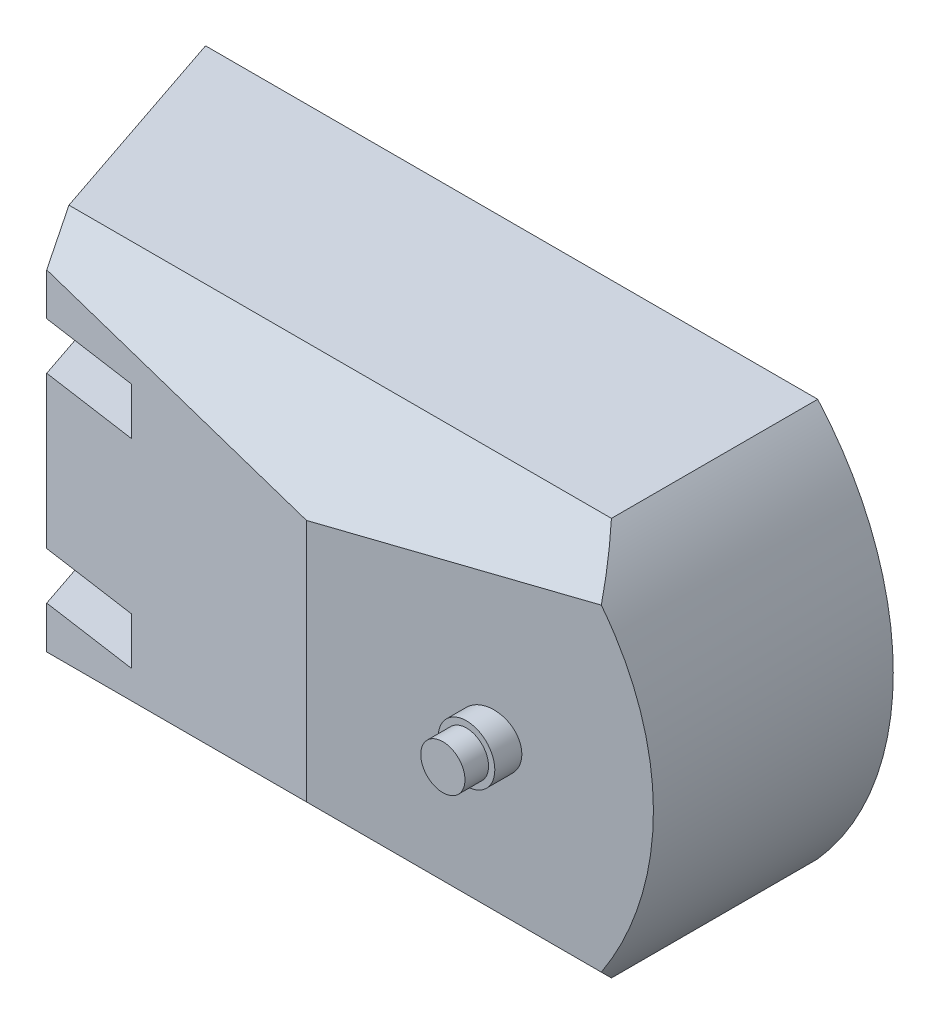
ISO-10303-21;
HEADER;
FILE_DESCRIPTION(('STEP AP214'),'2;1');
FILE_NAME('part.step','',(''),(''),'','','');
FILE_SCHEMA(('AUTOMOTIVE_DESIGN { 1 0 10303 214 1 1 1 1 }'));
ENDSEC;
DATA;
#1=APPLICATION_CONTEXT('core data for automotive mechanical design processes');
#2=APPLICATION_PROTOCOL_DEFINITION('international standard','automotive_design',2000,#1);
#3=PRODUCT_CONTEXT('',#1,'mechanical');
#4=PRODUCT('Part','Part','',(#3));
#5=PRODUCT_RELATED_PRODUCT_CATEGORY('part','',(#4));
#6=PRODUCT_DEFINITION_FORMATION('','',#4);
#7=PRODUCT_DEFINITION_CONTEXT('part definition',#1,'design');
#8=PRODUCT_DEFINITION('design','',#6,#7);
#9=PRODUCT_DEFINITION_SHAPE('','',#8);
#10=(LENGTH_UNIT() NAMED_UNIT(*) SI_UNIT(.MILLI.,.METRE.));
#11=(NAMED_UNIT(*) PLANE_ANGLE_UNIT() SI_UNIT($,.RADIAN.));
#12=(NAMED_UNIT(*) SI_UNIT($,.STERADIAN.) SOLID_ANGLE_UNIT());
#13=UNCERTAINTY_MEASURE_WITH_UNIT(LENGTH_MEASURE(1.E-05),#10,'distance_accuracy_value','');
#14=(GEOMETRIC_REPRESENTATION_CONTEXT(3) GLOBAL_UNCERTAINTY_ASSIGNED_CONTEXT((#13)) GLOBAL_UNIT_ASSIGNED_CONTEXT((#10,
#11,#12)) REPRESENTATION_CONTEXT('',''));
#15=CARTESIAN_POINT('',(0.,0.,0.));
#16=DIRECTION('',(0.,0.,1.));
#17=DIRECTION('',(1.,0.,0.));
#18=AXIS2_PLACEMENT_3D('',#15,#16,#17);
#19=CARTESIAN_POINT('',(-25135.3672162667,15090.4019973768,3000.));
#20=DIRECTION('',(0.,-1.,0.));
#21=DIRECTION('',(1.,0.,0.));
#22=AXIS2_PLACEMENT_3D('',#19,#20,#21);
#23=PLANE('',#22);
#24=DIRECTION('',(0.32020262993435,0.,0.947349078103275));
#25=VECTOR('',#24,1.);
#26=CARTESIAN_POINT('',(-22561.6903101328,15090.401997377,7625.81897217112));
#27=LINE('',#26,#25);
#28=CARTESIAN_POINT('',(-25135.3672162667,15090.401997377,11.3579514682041));
#29=VERTEX_POINT('',#28);
#30=CARTESIAN_POINT('',(-24401.1072626944,15090.401997377,2183.73389431267));
#31=VERTEX_POINT('',#30);
#32=EDGE_CURVE('E213',#29,#31,#27,.T.);
#33=ORIENTED_EDGE('',*,*,#32,.T.);
#34=DIRECTION('',(1.,0.,0.));
#35=VECTOR('',#34,1.);
#36=CARTESIAN_POINT('',(-25135.3672162667,15090.401997377,2183.73389431267));
#37=LINE('',#36,#35);
#38=CARTESIAN_POINT('',(-18658.5503124367,15090.401997377,2183.73389431267));
#39=VERTEX_POINT('',#38);
#40=EDGE_CURVE('E194',#31,#39,#37,.T.);
#41=ORIENTED_EDGE('',*,*,#40,.T.);
#42=DIRECTION('',(0.,0.,-1.));
#43=VECTOR('',#42,1.);
#44=CARTESIAN_POINT('',(-18658.5503124367,15090.401997377,3000.));
#45=LINE('',#44,#43);
#46=CARTESIAN_POINT('',(-18658.5503124367,15090.401997377,0.));
#47=VERTEX_POINT('',#46);
#48=EDGE_CURVE('E242',#39,#47,#45,.T.);
#49=ORIENTED_EDGE('',*,*,#48,.T.);
#50=DIRECTION('',(-1.,0.,0.));
#51=VECTOR('',#50,1.);
#52=CARTESIAN_POINT('',(-25135.3672162667,15090.4019973768,0.));
#53=LINE('',#52,#51);
#54=CARTESIAN_POINT('',(-25135.3672162667,15090.4019973768,0.));
#55=VERTEX_POINT('',#54);
#56=EDGE_CURVE('E230',#47,#55,#53,.T.);
#57=ORIENTED_EDGE('',*,*,#56,.T.);
#58=DIRECTION('',(0.,0.,-1.));
#59=VECTOR('',#58,1.);
#60=CARTESIAN_POINT('',(-25135.3672162667,15090.4019973768,3000.));
#61=LINE('',#60,#59);
#62=EDGE_CURVE('E248',#29,#55,#61,.T.);
#63=ORIENTED_EDGE('',*,*,#62,.F.);
#64=EDGE_LOOP('',(#33,#41,#49,#57,#63));
#65=FACE_BOUND('',#64,.T.);
#66=ADVANCED_FACE('F33',(#65),#23,.F.);
#67=CARTESIAN_POINT('',(-18658.5503124367,10876.7228833229,3000.));
#68=DIRECTION('',(0.,1.,0.));
#69=DIRECTION('',(-1.,0.,0.));
#70=AXIS2_PLACEMENT_3D('',#67,#68,#69);
#71=PLANE('',#70);
#72=DIRECTION('',(0.,0.,-1.));
#73=VECTOR('',#72,1.);
#74=CARTESIAN_POINT('',(-18658.5503124367,10876.7228833229,3000.));
#75=LINE('',#74,#73);
#76=CARTESIAN_POINT('',(-18658.5503124369,10876.7228833228,2183.73389431267));
#77=VERTEX_POINT('',#76);
#78=CARTESIAN_POINT('',(-18658.5503124367,10876.7228833229,0.));
#79=VERTEX_POINT('',#78);
#80=EDGE_CURVE('E244',#77,#79,#75,.T.);
#81=ORIENTED_EDGE('',*,*,#80,.F.);
#82=DIRECTION('',(1.,0.,0.));
#83=VECTOR('',#82,1.);
#84=CARTESIAN_POINT('',(-25135.3672162667,10876.7228833228,2183.73389431267));
#85=LINE('',#84,#83);
#86=CARTESIAN_POINT('',(-24401.1072626943,10876.7228833228,2183.73389431267));
#87=VERTEX_POINT('',#86);
#88=EDGE_CURVE('E193',#87,#77,#85,.T.);
#89=ORIENTED_EDGE('',*,*,#88,.F.);
#90=DIRECTION('',(0.32020262993435,0.,0.947349078103275));
#91=VECTOR('',#90,1.);
#92=CARTESIAN_POINT('',(-22561.6903101327,10876.7228833228,7625.81897217112));
#93=LINE('',#92,#91);
#94=CARTESIAN_POINT('',(-25135.3672162667,10876.7228833228,11.3579514679909));
#95=VERTEX_POINT('',#94);
#96=EDGE_CURVE('E216',#95,#87,#93,.T.);
#97=ORIENTED_EDGE('',*,*,#96,.F.);
#98=DIRECTION('',(0.,0.,-1.));
#99=VECTOR('',#98,1.);
#100=CARTESIAN_POINT('',(-25135.3672162667,10876.7228833229,3000.));
#101=LINE('',#100,#99);
#102=CARTESIAN_POINT('',(-25135.3672162667,10876.7228833229,0.));
#103=VERTEX_POINT('',#102);
#104=EDGE_CURVE('E246',#95,#103,#101,.T.);
#105=ORIENTED_EDGE('',*,*,#104,.T.);
#106=DIRECTION('',(1.,0.,0.));
#107=VECTOR('',#106,1.);
#108=CARTESIAN_POINT('',(-18658.5503124367,10876.7228833229,0.));
#109=LINE('',#108,#107);
#110=EDGE_CURVE('E236',#103,#79,#109,.T.);
#111=ORIENTED_EDGE('',*,*,#110,.T.);
#112=EDGE_LOOP('',(#81,#89,#97,#105,#111));
#113=FACE_BOUND('',#112,.T.);
#114=ADVANCED_FACE('F319',(#113),#71,.F.);
#115=CARTESIAN_POINT('',(-25135.3672162667,10876.7228833229,3000.));
#116=DIRECTION('',(1.,0.,0.));
#117=DIRECTION('',(0.,0.,-1.));
#118=AXIS2_PLACEMENT_3D('',#115,#116,#117);
#119=PLANE('',#118);
#120=DIRECTION('',(0.,-1.,0.));
#121=VECTOR('',#120,1.);
#122=CARTESIAN_POINT('',(-25135.3672162667,10876.722883323,11.3579514679909));
#123=LINE('',#122,#121);
#124=EDGE_CURVE('E250',#29,#95,#123,.T.);
#125=ORIENTED_EDGE('',*,*,#124,.F.);
#126=ORIENTED_EDGE('',*,*,#62,.T.);
#127=DIRECTION('',(0.,-1.,0.));
#128=VECTOR('',#127,1.);
#129=CARTESIAN_POINT('',(-25135.3672162667,10876.7228833229,0.));
#130=LINE('',#129,#128);
#131=EDGE_CURVE('E233',#55,#103,#130,.T.);
#132=ORIENTED_EDGE('',*,*,#131,.T.);
#133=ORIENTED_EDGE('',*,*,#104,.F.);
#134=EDGE_LOOP('',(#125,#126,#132,#133));
#135=FACE_BOUND('',#134,.T.);
#136=ADVANCED_FACE('F324',(#135),#119,.F.);
#137=CARTESIAN_POINT('',(-21033.8086312193,12983.5624403499,3000.));
#138=DIRECTION('',(0.,0.,-1.));
#139=DIRECTION('',(-1.,0.,0.));
#140=AXIS2_PLACEMENT_3D('',#137,#138,#139);
#141=CYLINDRICAL_SURFACE('',#140,3175.);
#142=ORIENTED_EDGE('',*,*,#48,.F.);
#143=CARTESIAN_POINT('',(-21033.8086312193,12983.5624403499,4290.57345133968));
#144=DIRECTION('',(0.,-0.707106781186544,-0.707106781186552));
#145=DIRECTION('',(0.,0.707106781186552,-0.707106781186544));
#146=AXIS2_PLACEMENT_3D('',#143,#144,#145);
#147=ELLIPSE('',#146,4490.12806053455,3175.);
#148=CARTESIAN_POINT('',(-18341.1629315927,14665.9072731004,2608.2286185892));
#149=VERTEX_POINT('',#148);
#150=EDGE_CURVE('E210',#39,#149,#147,.T.);
#151=ORIENTED_EDGE('',*,*,#150,.T.);
#152=CARTESIAN_POINT('',(-21033.8086312193,12983.5624403499,2994.81512738939));
#153=DIRECTION('',(0.14211404355638,0.,0.989850291015796));
#154=DIRECTION('',(0.989850291015796,0.,-0.14211404355638));
#155=AXIS2_PLACEMENT_3D('',#152,#153,#154);
#156=ELLIPSE('',#155,3207.55575748912,3175.);
#157=CARTESIAN_POINT('',(-18341.1629315928,11301.2176075993,2608.22861858922));
#158=VERTEX_POINT('',#157);
#159=EDGE_CURVE('E227',#158,#149,#156,.T.);
#160=ORIENTED_EDGE('',*,*,#159,.F.);
#161=CARTESIAN_POINT('',(-21033.8086312193,12983.5624403499,4290.57345133982));
#162=DIRECTION('',(0.,0.707106781186544,-0.707106781186551));
#163=DIRECTION('',(0.,-0.707106781186551,-0.707106781186544));
#164=AXIS2_PLACEMENT_3D('',#161,#162,#163);
#165=ELLIPSE('',#164,4490.12806053455,3175.);
#166=EDGE_CURVE('E202',#158,#77,#165,.T.);
#167=ORIENTED_EDGE('',*,*,#166,.T.);
#168=ORIENTED_EDGE('',*,*,#80,.T.);
#169=CARTESIAN_POINT('',(-21033.8086312193,12983.5624403499,0.));
#170=DIRECTION('',(0.,0.,1.));
#171=DIRECTION('',(1.,0.,0.));
#172=AXIS2_PLACEMENT_3D('',#169,#170,#171);
#173=CIRCLE('',#172,3175.);
#174=EDGE_CURVE('E239',#79,#47,#173,.T.);
#175=ORIENTED_EDGE('',*,*,#174,.T.);
#176=EDGE_LOOP('',(#142,#151,#160,#167,#168,#175));
#177=FACE_BOUND('',#176,.T.);
#178=ADVANCED_FACE('F376',(#177),#141,.T.);
#179=CARTESIAN_POINT('',(-21033.8086312193,12983.5624403499,0.));
#180=DIRECTION('',(0.,0.,1.));
#181=DIRECTION('',(1.,0.,0.));
#182=AXIS2_PLACEMENT_3D('',#179,#180,#181);
#183=PLANE('',#182);
#184=CARTESIAN_POINT('',(-20757.1879477292,12983.5624403498,0.));
#185=DIRECTION('',(0.,0.,1.));
#186=DIRECTION('',(1.,0.,0.));
#187=AXIS2_PLACEMENT_3D('',#184,#185,#186);
#188=CIRCLE('',#187,950.000000000001);
#189=CARTESIAN_POINT('',(-19807.1879477292,12983.5624403498,0.));
#190=VERTEX_POINT('',#189);
#191=EDGE_CURVE('E12',#190,#190,#188,.F.);
#192=ORIENTED_EDGE('',*,*,#191,.F.);
#193=EDGE_LOOP('',(#192));
#194=FACE_BOUND('',#193,.T.);
#195=ORIENTED_EDGE('',*,*,#56,.F.);
#196=ORIENTED_EDGE('',*,*,#174,.F.);
#197=ORIENTED_EDGE('',*,*,#110,.F.);
#198=ORIENTED_EDGE('',*,*,#131,.F.);
#199=EDGE_LOOP('',(#195,#196,#197,#198));
#200=FACE_BOUND('',#199,.T.);
#201=ADVANCED_FACE('F379',(#194,#200),#183,.F.);
#202=CARTESIAN_POINT('',(-3.52172393380601,10876.7228833232,-24.5294509489163));
#203=DIRECTION('',(0.14211404355638,0.,0.989850291015796));
#204=DIRECTION('',(0.989850291015796,0.,-0.14211404355638));
#205=AXIS2_PLACEMENT_3D('',#202,#203,#204);
#206=PLANE('',#205);
#207=CARTESIAN_POINT('',(-19376.7582167177,12983.5624403499,2756.91032812935));
#208=DIRECTION('',(0.14211404355638,0.,0.989850291015796));
#209=DIRECTION('',(0.989850291015796,0.,-0.14211404355638));
#210=AXIS2_PLACEMENT_3D('',#207,#208,#209);
#211=ELLIPSE('',#210,303.076134565903,300.000000000002);
#212=CARTESIAN_POINT('',(-19076.7582167177,12983.5624403499,2713.83895314075));
#213=VERTEX_POINT('',#212);
#214=EDGE_CURVE('E176',#213,#213,#211,.F.);
#215=ORIENTED_EDGE('',*,*,#214,.T.);
#216=EDGE_LOOP('',(#215));
#217=FACE_BOUND('',#216,.T.);
#218=DIRECTION('',(0.980003488088964,0.140700325752047,-0.140700325752045));
#219=VECTOR('',#218,1.);
#220=CARTESIAN_POINT('',(-889.022883731094,17171.5328342837,102.603057405959));
#221=LINE('',#220,#219);
#222=CARTESIAN_POINT('',(-21069.9222167178,14274.1358916896,3000.));
#223=VERTEX_POINT('',#222);
#224=EDGE_CURVE('E208',#223,#149,#221,.T.);
#225=ORIENTED_EDGE('',*,*,#224,.F.);
#226=DIRECTION('',(0.,1.,0.));
#227=VECTOR('',#226,1.);
#228=CARTESIAN_POINT('',(-21069.9222167177,10876.7228833228,3000.));
#229=LINE('',#228,#227);
#230=CARTESIAN_POINT('',(-21069.9222167177,11692.9889890101,3000.));
#231=VERTEX_POINT('',#230);
#232=EDGE_CURVE('E223',#231,#223,#229,.T.);
#233=ORIENTED_EDGE('',*,*,#232,.F.);
#234=DIRECTION('',(-0.980003488088964,0.140700325752046,0.140700325752045));
#235=VECTOR('',#234,1.);
#236=CARTESIAN_POINT('',(-308.012112278987,8712.17560371729,19.1866147072193));
#237=LINE('',#236,#235);
#238=EDGE_CURVE('E200',#158,#231,#237,.T.);
#239=ORIENTED_EDGE('',*,*,#238,.F.);
#240=ORIENTED_EDGE('',*,*,#159,.T.);
#241=EDGE_LOOP('',(#225,#233,#239,#240));
#242=FACE_BOUND('',#241,.T.);
#243=ADVANCED_FACE('F373',(#217,#242),#206,.T.);
#244=CARTESIAN_POINT('',(-22561.6903101327,10876.7228833228,7625.81897217112));
#245=DIRECTION('',(-0.947349078103275,0.,0.32020262993435));
#246=DIRECTION('',(0.32020262993435,0.,0.947349078103275));
#247=AXIS2_PLACEMENT_3D('',#244,#245,#246);
#248=PLANE('',#247);
#249=DIRECTION('',(-0.32020262993435,0.,-0.947349078103275));
#250=VECTOR('',#249,1.);
#251=CARTESIAN_POINT('',(-22561.6903101328,14286.9822188635,7625.81897217113));
#252=LINE('',#251,#250);
#253=CARTESIAN_POINT('',(-24281.0358022162,14286.9822188635,2538.97640876006));
#254=VERTEX_POINT('',#253);
#255=CARTESIAN_POINT('',(-24632.2083385222,14286.9822188635,1500.));
#256=VERTEX_POINT('',#255);
#257=EDGE_CURVE('E191',#254,#256,#252,.T.);
#258=ORIENTED_EDGE('',*,*,#257,.F.);
#259=DIRECTION('',(0.,1.,0.));
#260=VECTOR('',#259,1.);
#261=CARTESIAN_POINT('',(-24281.0358022161,10876.7228833228,2538.97640876006));
#262=LINE('',#261,#260);
#263=CARTESIAN_POINT('',(-24281.0358022162,14735.1594829296,2538.97640876006));
#264=VERTEX_POINT('',#263);
#265=EDGE_CURVE('E219',#254,#264,#262,.T.);
#266=ORIENTED_EDGE('',*,*,#265,.T.);
#267=DIRECTION('',(0.232454203475413,-0.687737247532305,0.687737247532297));
#268=VECTOR('',#267,1.);
#269=CARTESIAN_POINT('',(-22758.072395001,10229.3314698803,7044.80442180926));
#270=LINE('',#269,#268);
#271=EDGE_CURVE('E205',#31,#264,#270,.T.);
#272=ORIENTED_EDGE('',*,*,#271,.F.);
#273=ORIENTED_EDGE('',*,*,#32,.F.);
#274=ORIENTED_EDGE('',*,*,#124,.T.);
#275=ORIENTED_EDGE('',*,*,#96,.T.);
#276=DIRECTION('',(-0.232454203475391,-0.687737247532308,-0.687737247532301));
#277=VECTOR('',#276,1.);
#278=CARTESIAN_POINT('',(-23431.7023787088,13744.7968380583,5051.8078490482));
#279=LINE('',#278,#277);
#280=CARTESIAN_POINT('',(-24281.0358022162,11231.9653977702,2538.97640876005));
#281=VERTEX_POINT('',#280);
#282=EDGE_CURVE('E197',#281,#87,#279,.T.);
#283=ORIENTED_EDGE('',*,*,#282,.F.);
#284=CARTESIAN_POINT('',(-24281.0358022161,11680.1426618364,2538.97640876006));
#285=VERTEX_POINT('',#284);
#286=EDGE_CURVE('E220',#281,#285,#262,.T.);
#287=ORIENTED_EDGE('',*,*,#286,.T.);
#288=DIRECTION('',(0.32020262993435,0.,0.947349078103275));
#289=VECTOR('',#288,1.);
#290=CARTESIAN_POINT('',(-22561.6903101327,11680.1426618365,7625.8189721711));
#291=LINE('',#290,#289);
#292=CARTESIAN_POINT('',(-24632.2083385221,11680.1426618363,1500.));
#293=VERTEX_POINT('',#292);
#294=EDGE_CURVE('E55',#293,#285,#291,.T.);
#295=ORIENTED_EDGE('',*,*,#294,.F.);
#296=DIRECTION('',(0.,-1.,0.));
#297=VECTOR('',#296,1.);
#298=CARTESIAN_POINT('',(-24632.2083385221,10876.7228833228,1500.));
#299=LINE('',#298,#297);
#300=CARTESIAN_POINT('',(-24632.2083385221,12180.1426618363,1500.));
#301=VERTEX_POINT('',#300);
#302=EDGE_CURVE('E267',#301,#293,#299,.T.);
#303=ORIENTED_EDGE('',*,*,#302,.F.);
#304=DIRECTION('',(-0.32020262993435,0.,-0.947349078103275));
#305=VECTOR('',#304,1.);
#306=CARTESIAN_POINT('',(-22561.6903101327,12180.1426618365,7625.8189721711));
#307=LINE('',#306,#305);
#308=CARTESIAN_POINT('',(-24281.0358022162,12180.1426618363,2538.97640876005));
#309=VERTEX_POINT('',#308);
#310=EDGE_CURVE('E188',#309,#301,#307,.T.);
#311=ORIENTED_EDGE('',*,*,#310,.F.);
#312=CARTESIAN_POINT('',(-24281.0358022161,13786.9822188635,2538.97640876006));
#313=VERTEX_POINT('',#312);
#314=EDGE_CURVE('E224',#309,#313,#262,.T.);
#315=ORIENTED_EDGE('',*,*,#314,.T.);
#316=DIRECTION('',(0.32020262993435,0.,0.947349078103275));
#317=VECTOR('',#316,1.);
#318=CARTESIAN_POINT('',(-22561.6903101328,13786.9822188635,7625.81897217113));
#319=LINE('',#318,#317);
#320=CARTESIAN_POINT('',(-24632.2083385222,13786.9822188635,1500.));
#321=VERTEX_POINT('',#320);
#322=EDGE_CURVE('E47',#321,#313,#319,.T.);
#323=ORIENTED_EDGE('',*,*,#322,.F.);
#324=DIRECTION('',(0.,1.,0.));
#325=VECTOR('',#324,1.);
#326=CARTESIAN_POINT('',(-24632.2083385221,10876.7228833228,1500.));
#327=LINE('',#326,#325);
#328=EDGE_CURVE('E154',#321,#256,#327,.T.);
#329=ORIENTED_EDGE('',*,*,#328,.T.);
#330=EDGE_LOOP('',(#258,#266,#272,#273,#274,#275,#283,#287,#295,#303,#311,#315,#323,#329));
#331=FACE_BOUND('',#330,.T.);
#332=ADVANCED_FACE('F333',(#331),#248,.T.);
#333=CARTESIAN_POINT('',(-847.55148816409,10876.7228833232,5903.35104269325));
#334=DIRECTION('',(-0.14211404355638,0.,0.989850291015796));
#335=DIRECTION('',(0.989850291015796,0.,0.14211404355638));
#336=AXIS2_PLACEMENT_3D('',#333,#334,#335);
#337=PLANE('',#336);
#338=DIRECTION('',(-0.989850291015796,0.,-0.14211404355638));
#339=VECTOR('',#338,1.);
#340=CARTESIAN_POINT('',(-847.551488164088,14286.9822188634,5903.35104269326));
#341=LINE('',#340,#339);
#342=CARTESIAN_POINT('',(-23230.3672162667,14286.9822188635,2689.82221094062));
#343=VERTEX_POINT('',#342);
#344=EDGE_CURVE('E265',#343,#254,#341,.T.);
#345=ORIENTED_EDGE('',*,*,#344,.F.);
#346=DIRECTION('',(0.,1.,0.));
#347=VECTOR('',#346,1.);
#348=CARTESIAN_POINT('',(-23230.3672162667,10876.7228833232,2689.82221094061));
#349=LINE('',#348,#347);
#350=CARTESIAN_POINT('',(-23230.3672162667,13786.9822188635,2689.82221094062));
#351=VERTEX_POINT('',#350);
#352=EDGE_CURVE('E263',#351,#343,#349,.T.);
#353=ORIENTED_EDGE('',*,*,#352,.F.);
#354=DIRECTION('',(0.989850291015796,0.,0.14211404355638));
#355=VECTOR('',#354,1.);
#356=CARTESIAN_POINT('',(-847.551488164094,13786.9822188635,5903.35104269326));
#357=LINE('',#356,#355);
#358=EDGE_CURVE('E160',#313,#351,#357,.T.);
#359=ORIENTED_EDGE('',*,*,#358,.F.);
#360=ORIENTED_EDGE('',*,*,#314,.F.);
#361=DIRECTION('',(-0.989850291015796,0.,-0.14211404355638));
#362=VECTOR('',#361,1.);
#363=CARTESIAN_POINT('',(-847.551488164175,12180.1426618379,5903.35104269324));
#364=LINE('',#363,#362);
#365=CARTESIAN_POINT('',(-23230.3672162667,12180.1426618364,2689.82221094061));
#366=VERTEX_POINT('',#365);
#367=EDGE_CURVE('E260',#366,#309,#364,.T.);
#368=ORIENTED_EDGE('',*,*,#367,.F.);
#369=DIRECTION('',(0.,1.,0.));
#370=VECTOR('',#369,1.);
#371=CARTESIAN_POINT('',(-23230.3672162667,10876.7228833232,2689.82221094061));
#372=LINE('',#371,#370);
#373=CARTESIAN_POINT('',(-23230.3672162667,11680.1426618364,2689.82221094061));
#374=VERTEX_POINT('',#373);
#375=EDGE_CURVE('E258',#374,#366,#372,.T.);
#376=ORIENTED_EDGE('',*,*,#375,.F.);
#377=DIRECTION('',(0.989850291015796,0.,0.14211404355638));
#378=VECTOR('',#377,1.);
#379=CARTESIAN_POINT('',(-847.551488164144,11680.1426618379,5903.35104269324));
#380=LINE('',#379,#378);
#381=EDGE_CURVE('E256',#285,#374,#380,.T.);
#382=ORIENTED_EDGE('',*,*,#381,.F.);
#383=ORIENTED_EDGE('',*,*,#286,.F.);
#384=DIRECTION('',(-0.980003488088964,-0.140700325752047,-0.140700325752045));
#385=VECTOR('',#384,1.);
#386=CARTESIAN_POINT('',(-1360.43763122114,14522.7043270565,5829.71533804637));
#387=LINE('',#386,#385);
#388=EDGE_CURVE('E252',#231,#281,#387,.T.);
#389=ORIENTED_EDGE('',*,*,#388,.F.);
#390=ORIENTED_EDGE('',*,*,#232,.T.);
#391=DIRECTION('',(0.980003488088964,-0.140700325752046,0.140700325752045));
#392=VECTOR('',#391,1.);
#393=CARTESIAN_POINT('',(-779.426859769032,11361.0041109445,5913.13178074512));
#394=LINE('',#393,#392);
#395=EDGE_CURVE('E254',#264,#223,#394,.T.);
#396=ORIENTED_EDGE('',*,*,#395,.F.);
#397=ORIENTED_EDGE('',*,*,#265,.F.);
#398=EDGE_LOOP('',(#345,#353,#359,#360,#368,#376,#382,#383,#389,#390,#396,#397));
#399=FACE_BOUND('',#398,.T.);
#400=ADVANCED_FACE('F348',(#399),#337,.T.);
#401=CARTESIAN_POINT('',(-25135.3672162667,10876.7228833228,2183.73389431267));
#402=DIRECTION('',(0.,0.707106781186544,-0.707106781186551));
#403=DIRECTION('',(0.,0.707106781186551,0.707106781186544));
#404=AXIS2_PLACEMENT_3D('',#401,#402,#403);
#405=PLANE('',#404);
#406=ORIENTED_EDGE('',*,*,#238,.T.);
#407=ORIENTED_EDGE('',*,*,#388,.T.);
#408=ORIENTED_EDGE('',*,*,#282,.T.);
#409=ORIENTED_EDGE('',*,*,#88,.T.);
#410=ORIENTED_EDGE('',*,*,#166,.F.);
#411=EDGE_LOOP('',(#406,#407,#408,#409,#410));
#412=FACE_BOUND('',#411,.T.);
#413=ADVANCED_FACE('F409',(#412),#405,.F.);
#414=CARTESIAN_POINT('',(-25135.3672162667,15090.401997377,2183.73389431267));
#415=DIRECTION('',(0.,-0.707106781186544,-0.707106781186552));
#416=DIRECTION('',(0.,0.707106781186552,-0.707106781186544));
#417=AXIS2_PLACEMENT_3D('',#414,#415,#416);
#418=PLANE('',#417);
#419=ORIENTED_EDGE('',*,*,#40,.F.);
#420=ORIENTED_EDGE('',*,*,#271,.T.);
#421=ORIENTED_EDGE('',*,*,#395,.T.);
#422=ORIENTED_EDGE('',*,*,#224,.T.);
#423=ORIENTED_EDGE('',*,*,#150,.F.);
#424=EDGE_LOOP('',(#419,#420,#421,#422,#423));
#425=FACE_BOUND('',#424,.T.);
#426=ADVANCED_FACE('F369',(#425),#418,.F.);
#427=CARTESIAN_POINT('',(-25135.3672162667,12180.1426618363,1500.));
#428=DIRECTION('',(0.,1.,0.));
#429=DIRECTION('',(-1.,0.,0.));
#430=AXIS2_PLACEMENT_3D('',#427,#428,#429);
#431=PLANE('',#430);
#432=CARTESIAN_POINT('',(-23612.1268411229,12180.1426618364,2183.73389431267));
#433=DIRECTION('',(0.,1.,0.));
#434=DIRECTION('',(-1.,0.,0.));
#435=AXIS2_PLACEMENT_3D('',#432,#433,#434);
#436=CIRCLE('',#435,63.5000000000017);
#437=CARTESIAN_POINT('',(-23675.6268411229,12180.1426618364,2183.73389431267));
#438=VERTEX_POINT('',#437);
#439=EDGE_CURVE('E293',#438,#438,#436,.T.);
#440=ORIENTED_EDGE('',*,*,#439,.T.);
#441=EDGE_LOOP('',(#440));
#442=FACE_BOUND('',#441,.T.);
#443=ORIENTED_EDGE('',*,*,#310,.T.);
#444=DIRECTION('',(-1.,0.,0.));
#445=VECTOR('',#444,1.);
#446=CARTESIAN_POINT('',(-25135.3672162667,12180.1426618363,1500.));
#447=LINE('',#446,#445);
#448=CARTESIAN_POINT('',(-23230.3672162667,12180.1426618364,1500.));
#449=VERTEX_POINT('',#448);
#450=EDGE_CURVE('E179',#449,#301,#447,.T.);
#451=ORIENTED_EDGE('',*,*,#450,.F.);
#452=DIRECTION('',(0.,0.,1.));
#453=VECTOR('',#452,1.);
#454=CARTESIAN_POINT('',(-23230.3672162667,12180.1426618364,1500.));
#455=LINE('',#454,#453);
#456=EDGE_CURVE('E155',#449,#366,#455,.T.);
#457=ORIENTED_EDGE('',*,*,#456,.T.);
#458=ORIENTED_EDGE('',*,*,#367,.T.);
#459=EDGE_LOOP('',(#443,#451,#457,#458));
#460=FACE_BOUND('',#459,.T.);
#461=ADVANCED_FACE('F362',(#442,#460),#431,.F.);
#462=CARTESIAN_POINT('',(-23230.3672162667,11680.1426618364,1500.));
#463=DIRECTION('',(1.,0.,0.));
#464=DIRECTION('',(0.,0.,-1.));
#465=AXIS2_PLACEMENT_3D('',#462,#463,#464);
#466=PLANE('',#465);
#467=ORIENTED_EDGE('',*,*,#375,.T.);
#468=ORIENTED_EDGE('',*,*,#456,.F.);
#469=DIRECTION('',(0.,1.,0.));
#470=VECTOR('',#469,1.);
#471=CARTESIAN_POINT('',(-23230.3672162667,11680.1426618364,1500.));
#472=LINE('',#471,#470);
#473=CARTESIAN_POINT('',(-23230.3672162667,11680.1426618364,1500.));
#474=VERTEX_POINT('',#473);
#475=EDGE_CURVE('E175',#474,#449,#472,.T.);
#476=ORIENTED_EDGE('',*,*,#475,.F.);
#477=DIRECTION('',(0.,0.,1.));
#478=VECTOR('',#477,1.);
#479=CARTESIAN_POINT('',(-23230.3672162667,11680.1426618364,1500.));
#480=LINE('',#479,#478);
#481=EDGE_CURVE('E182',#474,#374,#480,.T.);
#482=ORIENTED_EDGE('',*,*,#481,.T.);
#483=EDGE_LOOP('',(#467,#468,#476,#482));
#484=FACE_BOUND('',#483,.T.);
#485=ADVANCED_FACE('F356',(#484),#466,.F.);
#486=CARTESIAN_POINT('',(-25135.3672162667,11680.1426618363,1500.));
#487=DIRECTION('',(0.,-1.,0.));
#488=DIRECTION('',(1.,0.,0.));
#489=AXIS2_PLACEMENT_3D('',#486,#487,#488);
#490=PLANE('',#489);
#491=CARTESIAN_POINT('',(-23612.1268411229,11680.1426618364,2183.73389431267));
#492=DIRECTION('',(0.,-1.,0.));
#493=DIRECTION('',(1.,0.,0.));
#494=AXIS2_PLACEMENT_3D('',#491,#492,#493);
#495=CIRCLE('',#494,63.5000000000017);
#496=CARTESIAN_POINT('',(-23548.6268411229,11680.1426618364,2183.73389431267));
#497=VERTEX_POINT('',#496);
#498=EDGE_CURVE('E279',#497,#497,#495,.T.);
#499=ORIENTED_EDGE('',*,*,#498,.T.);
#500=EDGE_LOOP('',(#499));
#501=FACE_BOUND('',#500,.T.);
#502=ORIENTED_EDGE('',*,*,#294,.T.);
#503=ORIENTED_EDGE('',*,*,#381,.T.);
#504=ORIENTED_EDGE('',*,*,#481,.F.);
#505=DIRECTION('',(1.,0.,0.));
#506=VECTOR('',#505,1.);
#507=CARTESIAN_POINT('',(-25135.3672162667,11680.1426618363,1500.));
#508=LINE('',#507,#506);
#509=EDGE_CURVE('E173',#293,#474,#508,.T.);
#510=ORIENTED_EDGE('',*,*,#509,.F.);
#511=EDGE_LOOP('',(#502,#503,#504,#510));
#512=FACE_BOUND('',#511,.T.);
#513=ADVANCED_FACE('F353',(#501,#512),#490,.F.);
#514=CARTESIAN_POINT('',(0.,0.,1500.));
#515=DIRECTION('',(0.,0.,-1.));
#516=DIRECTION('',(-1.,0.,0.));
#517=AXIS2_PLACEMENT_3D('',#514,#515,#516);
#518=PLANE('',#517);
#519=ORIENTED_EDGE('',*,*,#302,.T.);
#520=ORIENTED_EDGE('',*,*,#509,.T.);
#521=ORIENTED_EDGE('',*,*,#475,.T.);
#522=ORIENTED_EDGE('',*,*,#450,.T.);
#523=EDGE_LOOP('',(#519,#520,#521,#522));
#524=FACE_BOUND('',#523,.T.);
#525=ADVANCED_FACE('F359',(#524),#518,.F.);
#526=CARTESIAN_POINT('',(-25135.3672162667,14286.9822188635,1500.));
#527=DIRECTION('',(0.,1.,0.));
#528=DIRECTION('',(-1.,0.,0.));
#529=AXIS2_PLACEMENT_3D('',#526,#527,#528);
#530=PLANE('',#529);
#531=CARTESIAN_POINT('',(-23612.1268411229,14286.9822188635,2183.73389431267));
#532=DIRECTION('',(0.,1.,0.));
#533=DIRECTION('',(-1.,0.,0.));
#534=AXIS2_PLACEMENT_3D('',#531,#532,#533);
#535=CIRCLE('',#534,63.5000000000017);
#536=CARTESIAN_POINT('',(-23675.6268411229,14286.9822188635,2183.73389431267));
#537=VERTEX_POINT('',#536);
#538=EDGE_CURVE('E274',#537,#537,#535,.T.);
#539=ORIENTED_EDGE('',*,*,#538,.T.);
#540=EDGE_LOOP('',(#539));
#541=FACE_BOUND('',#540,.T.);
#542=ORIENTED_EDGE('',*,*,#257,.T.);
#543=DIRECTION('',(-1.,0.,0.));
#544=VECTOR('',#543,1.);
#545=CARTESIAN_POINT('',(-25135.3672162667,14286.9822188635,1500.));
#546=LINE('',#545,#544);
#547=CARTESIAN_POINT('',(-23230.3672162667,14286.9822188635,1500.));
#548=VERTEX_POINT('',#547);
#549=EDGE_CURVE('E164',#548,#256,#546,.T.);
#550=ORIENTED_EDGE('',*,*,#549,.F.);
#551=DIRECTION('',(0.,0.,1.));
#552=VECTOR('',#551,1.);
#553=CARTESIAN_POINT('',(-23230.3672162667,14286.9822188635,1500.));
#554=LINE('',#553,#552);
#555=EDGE_CURVE('E163',#548,#343,#554,.T.);
#556=ORIENTED_EDGE('',*,*,#555,.T.);
#557=ORIENTED_EDGE('',*,*,#344,.T.);
#558=EDGE_LOOP('',(#542,#550,#556,#557));
#559=FACE_BOUND('',#558,.T.);
#560=ADVANCED_FACE('F458',(#541,#559),#530,.F.);
#561=CARTESIAN_POINT('',(-23230.3672162667,14286.9822188635,1500.));
#562=DIRECTION('',(1.,0.,0.));
#563=DIRECTION('',(0.,0.,-1.));
#564=AXIS2_PLACEMENT_3D('',#561,#562,#563);
#565=PLANE('',#564);
#566=ORIENTED_EDGE('',*,*,#352,.T.);
#567=ORIENTED_EDGE('',*,*,#555,.F.);
#568=DIRECTION('',(0.,1.,0.));
#569=VECTOR('',#568,1.);
#570=CARTESIAN_POINT('',(-23230.3672162667,14286.9822188635,1500.));
#571=LINE('',#570,#569);
#572=CARTESIAN_POINT('',(-23230.3672162667,13786.9822188635,1500.));
#573=VERTEX_POINT('',#572);
#574=EDGE_CURVE('E151',#573,#548,#571,.T.);
#575=ORIENTED_EDGE('',*,*,#574,.F.);
#576=DIRECTION('',(0.,0.,1.));
#577=VECTOR('',#576,1.);
#578=CARTESIAN_POINT('',(-23230.3672162667,13786.9822188635,1500.));
#579=LINE('',#578,#577);
#580=EDGE_CURVE('E158',#573,#351,#579,.T.);
#581=ORIENTED_EDGE('',*,*,#580,.T.);
#582=EDGE_LOOP('',(#566,#567,#575,#581));
#583=FACE_BOUND('',#582,.T.);
#584=ADVANCED_FACE('F166',(#583),#565,.F.);
#585=CARTESIAN_POINT('',(-25135.3672162667,13786.9822188635,1500.));
#586=DIRECTION('',(0.,-1.,0.));
#587=DIRECTION('',(1.,0.,0.));
#588=AXIS2_PLACEMENT_3D('',#585,#586,#587);
#589=PLANE('',#588);
#590=CARTESIAN_POINT('',(-23612.1268411229,13786.9822188635,2183.73389431267));
#591=DIRECTION('',(0.,-1.,0.));
#592=DIRECTION('',(1.,0.,0.));
#593=AXIS2_PLACEMENT_3D('',#590,#591,#592);
#594=CIRCLE('',#593,63.5000000000017);
#595=CARTESIAN_POINT('',(-23548.6268411229,13786.9822188635,2183.73389431267));
#596=VERTEX_POINT('',#595);
#597=EDGE_CURVE('E272',#596,#596,#594,.T.);
#598=ORIENTED_EDGE('',*,*,#597,.T.);
#599=EDGE_LOOP('',(#598));
#600=FACE_BOUND('',#599,.T.);
#601=ORIENTED_EDGE('',*,*,#322,.T.);
#602=ORIENTED_EDGE('',*,*,#358,.T.);
#603=ORIENTED_EDGE('',*,*,#580,.F.);
#604=DIRECTION('',(1.,0.,0.));
#605=VECTOR('',#604,1.);
#606=CARTESIAN_POINT('',(-25135.3672162667,13786.9822188635,1500.));
#607=LINE('',#606,#605);
#608=EDGE_CURVE('E146',#321,#573,#607,.T.);
#609=ORIENTED_EDGE('',*,*,#608,.F.);
#610=EDGE_LOOP('',(#601,#602,#603,#609));
#611=FACE_BOUND('',#610,.T.);
#612=ADVANCED_FACE('F159',(#600,#611),#589,.F.);
#613=CARTESIAN_POINT('',(0.,0.,1500.));
#614=DIRECTION('',(0.,0.,1.));
#615=DIRECTION('',(1.,0.,0.));
#616=AXIS2_PLACEMENT_3D('',#613,#614,#615);
#617=PLANE('',#616);
#618=ORIENTED_EDGE('',*,*,#608,.T.);
#619=ORIENTED_EDGE('',*,*,#574,.T.);
#620=ORIENTED_EDGE('',*,*,#549,.T.);
#621=ORIENTED_EDGE('',*,*,#328,.F.);
#622=EDGE_LOOP('',(#618,#619,#620,#621));
#623=FACE_BOUND('',#622,.T.);
#624=ADVANCED_FACE('F148',(#623),#617,.T.);
#625=CARTESIAN_POINT('',(-19376.7582167177,12983.5624403499,3000.));
#626=DIRECTION('',(0.,0.,-1.));
#627=DIRECTION('',(-1.,0.,0.));
#628=AXIS2_PLACEMENT_3D('',#625,#626,#627);
#629=CYLINDRICAL_SURFACE('',#628,300.000000000002);
#630=ORIENTED_EDGE('',*,*,#214,.F.);
#631=EDGE_LOOP('',(#630));
#632=FACE_BOUND('',#631,.T.);
#633=CARTESIAN_POINT('',(-19376.7582167177,12983.5624403499,3000.));
#634=DIRECTION('',(0.,0.,1.));
#635=DIRECTION('',(1.,0.,0.));
#636=AXIS2_PLACEMENT_3D('',#633,#634,#635);
#637=CIRCLE('',#636,300.000000000002);
#638=CARTESIAN_POINT('',(-19076.7582167177,12983.5624403499,3000.));
#639=VERTEX_POINT('',#638);
#640=EDGE_CURVE('E271',#639,#639,#637,.T.);
#641=ORIENTED_EDGE('',*,*,#640,.F.);
#642=EDGE_LOOP('',(#641));
#643=FACE_BOUND('',#642,.T.);
#644=ADVANCED_FACE('F305',(#632,#643),#629,.T.);
#645=CARTESIAN_POINT('',(-19376.7582167177,12983.5624403499,3000.));
#646=DIRECTION('',(0.,0.,1.));
#647=DIRECTION('',(1.,0.,0.));
#648=AXIS2_PLACEMENT_3D('',#645,#646,#647);
#649=PLANE('',#648);
#650=CARTESIAN_POINT('',(-19376.7582167177,12983.5624403499,3000.));
#651=DIRECTION('',(0.,0.,1.));
#652=DIRECTION('',(1.,0.,0.));
#653=AXIS2_PLACEMENT_3D('',#650,#651,#652);
#654=CIRCLE('',#653,234.000000000002);
#655=CARTESIAN_POINT('',(-19142.7582167177,12983.5624403499,3000.));
#656=VERTEX_POINT('',#655);
#657=EDGE_CURVE('E40',#656,#656,#654,.T.);
#658=ORIENTED_EDGE('',*,*,#657,.F.);
#659=EDGE_LOOP('',(#658));
#660=FACE_BOUND('',#659,.T.);
#661=ORIENTED_EDGE('',*,*,#640,.T.);
#662=EDGE_LOOP('',(#661));
#663=FACE_BOUND('',#662,.T.);
#664=ADVANCED_FACE('F303',(#660,#663),#649,.T.);
#665=CARTESIAN_POINT('',(-19376.7582167177,12983.5624403499,3250.));
#666=DIRECTION('',(0.,0.,-1.));
#667=DIRECTION('',(-1.,0.,0.));
#668=AXIS2_PLACEMENT_3D('',#665,#666,#667);
#669=CYLINDRICAL_SURFACE('',#668,234.000000000002);
#670=CARTESIAN_POINT('',(-19376.7582167177,12983.5624403499,3250.));
#671=DIRECTION('',(0.,0.,1.));
#672=DIRECTION('',(1.,0.,0.));
#673=AXIS2_PLACEMENT_3D('',#670,#671,#672);
#674=CIRCLE('',#673,234.000000000002);
#675=CARTESIAN_POINT('',(-19142.7582167177,12983.5624403499,3250.));
#676=VERTEX_POINT('',#675);
#677=EDGE_CURVE('E296',#676,#676,#674,.T.);
#678=ORIENTED_EDGE('',*,*,#677,.F.);
#679=EDGE_LOOP('',(#678));
#680=FACE_BOUND('',#679,.T.);
#681=ORIENTED_EDGE('',*,*,#657,.T.);
#682=EDGE_LOOP('',(#681));
#683=FACE_BOUND('',#682,.T.);
#684=ADVANCED_FACE('F313',(#680,#683),#669,.T.);
#685=CARTESIAN_POINT('',(-19376.7582167177,12983.5624403499,3250.));
#686=DIRECTION('',(0.,0.,1.));
#687=DIRECTION('',(1.,0.,0.));
#688=AXIS2_PLACEMENT_3D('',#685,#686,#687);
#689=PLANE('',#688);
#690=ORIENTED_EDGE('',*,*,#677,.T.);
#691=EDGE_LOOP('',(#690));
#692=FACE_BOUND('',#691,.T.);
#693=ADVANCED_FACE('F501',(#692),#689,.T.);
#694=CARTESIAN_POINT('',(-23612.1268411229,14733.5624403498,2183.73389431267));
#695=DIRECTION('',(0.,-1.,0.));
#696=DIRECTION('',(1.,0.,0.));
#697=AXIS2_PLACEMENT_3D('',#694,#695,#696);
#698=CYLINDRICAL_SURFACE('',#697,63.5000000000017);
#699=ORIENTED_EDGE('',*,*,#597,.F.);
#700=EDGE_LOOP('',(#699));
#701=FACE_BOUND('',#700,.T.);
#702=ORIENTED_EDGE('',*,*,#439,.F.);
#703=EDGE_LOOP('',(#702));
#704=FACE_BOUND('',#703,.T.);
#705=ADVANCED_FACE('F511',(#701,#704),#698,.F.);
#706=CARTESIAN_POINT('',(-23612.1268411229,14733.5624403498,2183.73389431267));
#707=DIRECTION('',(0.,-1.,0.));
#708=DIRECTION('',(1.,0.,0.));
#709=AXIS2_PLACEMENT_3D('',#706,#707,#708);
#710=PLANE('',#709);
#711=CARTESIAN_POINT('',(-23612.1268411229,14733.5624403498,2183.73389431267));
#712=DIRECTION('',(0.,-1.,0.));
#713=DIRECTION('',(1.,0.,0.));
#714=AXIS2_PLACEMENT_3D('',#711,#712,#713);
#715=CIRCLE('',#714,63.5000000000017);
#716=CARTESIAN_POINT('',(-23548.6268411229,14733.5624403498,2183.73389431267));
#717=VERTEX_POINT('',#716);
#718=EDGE_CURVE('E275',#717,#717,#715,.T.);
#719=ORIENTED_EDGE('',*,*,#718,.T.);
#720=EDGE_LOOP('',(#719));
#721=FACE_BOUND('',#720,.T.);
#722=ADVANCED_FACE('F548',(#721),#710,.T.);
#723=ORIENTED_EDGE('',*,*,#718,.F.);
#724=EDGE_LOOP('',(#723));
#725=FACE_BOUND('',#724,.T.);
#726=ORIENTED_EDGE('',*,*,#538,.F.);
#727=EDGE_LOOP('',(#726));
#728=FACE_BOUND('',#727,.T.);
#729=ADVANCED_FACE('F552',(#725,#728),#698,.F.);
#730=CARTESIAN_POINT('',(-23612.1268411229,11233.5624403498,2183.73389431267));
#731=DIRECTION('',(0.,-1.,0.));
#732=DIRECTION('',(1.,0.,0.));
#733=AXIS2_PLACEMENT_3D('',#730,#731,#732);
#734=CIRCLE('',#733,63.5000000000017);
#735=CARTESIAN_POINT('',(-23548.6268411229,11233.5624403498,2183.73389431267));
#736=VERTEX_POINT('',#735);
#737=EDGE_CURVE('E282',#736,#736,#734,.T.);
#738=ORIENTED_EDGE('',*,*,#737,.T.);
#739=EDGE_LOOP('',(#738));
#740=FACE_BOUND('',#739,.T.);
#741=ORIENTED_EDGE('',*,*,#498,.F.);
#742=EDGE_LOOP('',(#741));
#743=FACE_BOUND('',#742,.T.);
#744=ADVANCED_FACE('F551',(#740,#743),#698,.F.);
#745=CARTESIAN_POINT('',(-23612.1268411229,11233.5624403498,2183.73389431267));
#746=DIRECTION('',(0.,-1.,0.));
#747=DIRECTION('',(1.,0.,0.));
#748=AXIS2_PLACEMENT_3D('',#745,#746,#747);
#749=PLANE('',#748);
#750=ORIENTED_EDGE('',*,*,#737,.F.);
#751=EDGE_LOOP('',(#750));
#752=FACE_BOUND('',#751,.T.);
#753=ADVANCED_FACE('F576',(#752),#749,.F.);
#754=CARTESIAN_POINT('',(-20757.1879477292,12983.5624403498,-500.));
#755=DIRECTION('',(0.,0.,1.));
#756=DIRECTION('',(1.,0.,0.));
#757=AXIS2_PLACEMENT_3D('',#754,#755,#756);
#758=CYLINDRICAL_SURFACE('',#757,950.000000000001);
#759=CARTESIAN_POINT('',(-20757.1879477292,12983.5624403498,-500.));
#760=DIRECTION('',(0.,0.,-1.));
#761=DIRECTION('',(-1.,0.,0.));
#762=AXIS2_PLACEMENT_3D('',#759,#760,#761);
#763=CIRCLE('',#762,950.000000000001);
#764=CARTESIAN_POINT('',(-21707.1879477293,12983.5624403498,-500.));
#765=VERTEX_POINT('',#764);
#766=EDGE_CURVE('E287',#765,#765,#763,.T.);
#767=ORIENTED_EDGE('',*,*,#766,.F.);
#768=EDGE_LOOP('',(#767));
#769=FACE_BOUND('',#768,.T.);
#770=ORIENTED_EDGE('',*,*,#191,.T.);
#771=EDGE_LOOP('',(#770));
#772=FACE_BOUND('',#771,.T.);
#773=ADVANCED_FACE('F584',(#769,#772),#758,.T.);
#774=CARTESIAN_POINT('',(-20757.1879477292,12983.5624403498,-500.));
#775=DIRECTION('',(0.,0.,-1.));
#776=DIRECTION('',(-1.,0.,0.));
#777=AXIS2_PLACEMENT_3D('',#774,#775,#776);
#778=PLANE('',#777);
#779=ORIENTED_EDGE('',*,*,#766,.T.);
#780=EDGE_LOOP('',(#779));
#781=FACE_BOUND('',#780,.T.);
#782=ADVANCED_FACE('F598',(#781),#778,.T.);
#783=CLOSED_SHELL('',(#66,#114,#136,#178,#201,#243,#332,#400,#413,#426,#461,#485,#513,#525,#560,
#584,#612,#624,#644,#664,#684,#693,#705,#722,#729,#744,#753,#773,#782));
#784=MANIFOLD_SOLID_BREP('B2',#783);
#785=ADVANCED_BREP_SHAPE_REPRESENTATION('',(#18,#784),#14);
#786=SHAPE_DEFINITION_REPRESENTATION(#9,#785);
ENDSEC;
END-ISO-10303-21;
